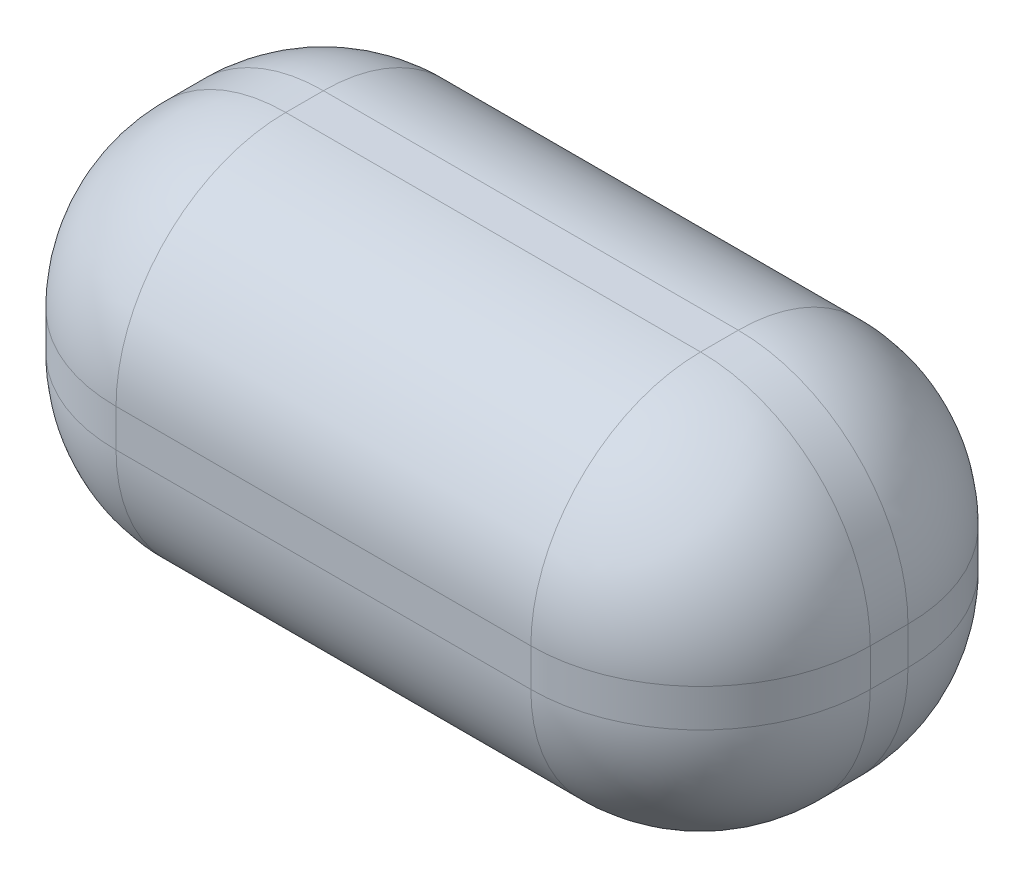
ISO-10303-21;
HEADER;
FILE_DESCRIPTION(('STEP AP214'),'2;1');
FILE_NAME('part.step','',(''),(''),'','','');
FILE_SCHEMA(('AUTOMOTIVE_DESIGN { 1 0 10303 214 1 1 1 1 }'));
ENDSEC;
DATA;
#1=APPLICATION_CONTEXT('core data for automotive mechanical design processes');
#2=APPLICATION_PROTOCOL_DEFINITION('international standard','automotive_design',2000,#1);
#3=PRODUCT_CONTEXT('',#1,'mechanical');
#4=PRODUCT('Part','Part','',(#3));
#5=PRODUCT_RELATED_PRODUCT_CATEGORY('part','',(#4));
#6=PRODUCT_DEFINITION_FORMATION('','',#4);
#7=PRODUCT_DEFINITION_CONTEXT('part definition',#1,'design');
#8=PRODUCT_DEFINITION('design','',#6,#7);
#9=PRODUCT_DEFINITION_SHAPE('','',#8);
#10=(LENGTH_UNIT() NAMED_UNIT(*) SI_UNIT(.MILLI.,.METRE.));
#11=(NAMED_UNIT(*) PLANE_ANGLE_UNIT() SI_UNIT($,.RADIAN.));
#12=(NAMED_UNIT(*) SI_UNIT($,.STERADIAN.) SOLID_ANGLE_UNIT());
#13=UNCERTAINTY_MEASURE_WITH_UNIT(LENGTH_MEASURE(1.E-05),#10,'distance_accuracy_value','');
#14=(GEOMETRIC_REPRESENTATION_CONTEXT(3) GLOBAL_UNCERTAINTY_ASSIGNED_CONTEXT((#13)) GLOBAL_UNIT_ASSIGNED_CONTEXT((#10,
#11,#12)) REPRESENTATION_CONTEXT('',''));
#15=CARTESIAN_POINT('',(0.,0.,0.));
#16=DIRECTION('',(0.,0.,1.));
#17=DIRECTION('',(1.,0.,0.));
#18=AXIS2_PLACEMENT_3D('',#15,#16,#17);
#19=CARTESIAN_POINT('',(100.,-50.,50.));
#20=DIRECTION('',(-1.,0.,0.));
#21=DIRECTION('',(0.,0.,1.));
#22=AXIS2_PLACEMENT_3D('',#19,#20,#21);
#23=PLANE('',#22);
#24=DIRECTION('',(0.,1.,0.));
#25=VECTOR('',#24,1.);
#26=CARTESIAN_POINT('',(100.,-50.,5.));
#27=LINE('',#26,#25);
#28=CARTESIAN_POINT('',(100.,5.,5.));
#29=VERTEX_POINT('',#28);
#30=CARTESIAN_POINT('',(100.,-5.,5.));
#31=VERTEX_POINT('',#30);
#32=EDGE_CURVE('E208',#29,#31,#27,.F.);
#33=ORIENTED_EDGE('',*,*,#32,.T.);
#34=DIRECTION('',(0.,0.,-1.));
#35=VECTOR('',#34,1.);
#36=CARTESIAN_POINT('',(100.,-5.,50.));
#37=LINE('',#36,#35);
#38=CARTESIAN_POINT('',(100.,-5.,-5.));
#39=VERTEX_POINT('',#38);
#40=EDGE_CURVE('E147',#31,#39,#37,.T.);
#41=ORIENTED_EDGE('',*,*,#40,.T.);
#42=DIRECTION('',(0.,1.,0.));
#43=VECTOR('',#42,1.);
#44=CARTESIAN_POINT('',(100.,50.,-5.));
#45=LINE('',#44,#43);
#46=CARTESIAN_POINT('',(100.,5.,-5.));
#47=VERTEX_POINT('',#46);
#48=EDGE_CURVE('E211',#39,#47,#45,.T.);
#49=ORIENTED_EDGE('',*,*,#48,.T.);
#50=DIRECTION('',(0.,0.,-1.));
#51=VECTOR('',#50,1.);
#52=CARTESIAN_POINT('',(100.,5.,50.));
#53=LINE('',#52,#51);
#54=EDGE_CURVE('E205',#47,#29,#53,.F.);
#55=ORIENTED_EDGE('',*,*,#54,.T.);
#56=EDGE_LOOP('',(#33,#41,#49,#55));
#57=FACE_BOUND('',#56,.T.);
#58=ADVANCED_FACE('F39',(#57),#23,.F.);
#59=CARTESIAN_POINT('',(-100.,50.,50.));
#60=DIRECTION('',(0.,-1.,0.));
#61=DIRECTION('',(0.,0.,-1.));
#62=AXIS2_PLACEMENT_3D('',#59,#60,#61);
#63=PLANE('',#62);
#64=DIRECTION('',(-1.,0.,0.));
#65=VECTOR('',#64,1.);
#66=CARTESIAN_POINT('',(-100.,50.,5.));
#67=LINE('',#66,#65);
#68=CARTESIAN_POINT('',(-55.,50.,5.));
#69=VERTEX_POINT('',#68);
#70=CARTESIAN_POINT('',(55.,50.,5.));
#71=VERTEX_POINT('',#70);
#72=EDGE_CURVE('E49',#69,#71,#67,.F.);
#73=ORIENTED_EDGE('',*,*,#72,.T.);
#74=DIRECTION('',(0.,0.,-1.));
#75=VECTOR('',#74,1.);
#76=CARTESIAN_POINT('',(55.,50.,50.));
#77=LINE('',#76,#75);
#78=CARTESIAN_POINT('',(55.,50.,-5.));
#79=VERTEX_POINT('',#78);
#80=EDGE_CURVE('E11',#71,#79,#77,.T.);
#81=ORIENTED_EDGE('',*,*,#80,.T.);
#82=DIRECTION('',(-1.,0.,0.));
#83=VECTOR('',#82,1.);
#84=CARTESIAN_POINT('',(-100.,50.,-5.));
#85=LINE('',#84,#83);
#86=CARTESIAN_POINT('',(-55.,50.,-5.));
#87=VERTEX_POINT('',#86);
#88=EDGE_CURVE('E229',#79,#87,#85,.T.);
#89=ORIENTED_EDGE('',*,*,#88,.T.);
#90=DIRECTION('',(0.,0.,-1.));
#91=VECTOR('',#90,1.);
#92=CARTESIAN_POINT('',(-55.,50.,50.));
#93=LINE('',#92,#91);
#94=EDGE_CURVE('E60',#87,#69,#93,.F.);
#95=ORIENTED_EDGE('',*,*,#94,.T.);
#96=EDGE_LOOP('',(#73,#81,#89,#95));
#97=FACE_BOUND('',#96,.T.);
#98=ADVANCED_FACE('F326',(#97),#63,.F.);
#99=CARTESIAN_POINT('',(-100.,-50.,50.));
#100=DIRECTION('',(1.,0.,0.));
#101=DIRECTION('',(0.,0.,-1.));
#102=AXIS2_PLACEMENT_3D('',#99,#100,#101);
#103=PLANE('',#102);
#104=DIRECTION('',(0.,-1.,0.));
#105=VECTOR('',#104,1.);
#106=CARTESIAN_POINT('',(-100.,-50.,-5.));
#107=LINE('',#106,#105);
#108=CARTESIAN_POINT('',(-100.,5.,-5.));
#109=VERTEX_POINT('',#108);
#110=CARTESIAN_POINT('',(-100.,-5.,-5.));
#111=VERTEX_POINT('',#110);
#112=EDGE_CURVE('E185',#109,#111,#107,.T.);
#113=ORIENTED_EDGE('',*,*,#112,.T.);
#114=DIRECTION('',(0.,0.,-1.));
#115=VECTOR('',#114,1.);
#116=CARTESIAN_POINT('',(-100.,-5.,50.));
#117=LINE('',#116,#115);
#118=CARTESIAN_POINT('',(-100.,-5.,5.));
#119=VERTEX_POINT('',#118);
#120=EDGE_CURVE('E188',#111,#119,#117,.F.);
#121=ORIENTED_EDGE('',*,*,#120,.T.);
#122=DIRECTION('',(0.,-1.,0.));
#123=VECTOR('',#122,1.);
#124=CARTESIAN_POINT('',(-100.,-50.,5.));
#125=LINE('',#124,#123);
#126=CARTESIAN_POINT('',(-100.,5.,5.));
#127=VERTEX_POINT('',#126);
#128=EDGE_CURVE('E182',#119,#127,#125,.F.);
#129=ORIENTED_EDGE('',*,*,#128,.T.);
#130=DIRECTION('',(0.,0.,-1.));
#131=VECTOR('',#130,1.);
#132=CARTESIAN_POINT('',(-100.,5.,50.));
#133=LINE('',#132,#131);
#134=EDGE_CURVE('E179',#127,#109,#133,.T.);
#135=ORIENTED_EDGE('',*,*,#134,.T.);
#136=EDGE_LOOP('',(#113,#121,#129,#135));
#137=FACE_BOUND('',#136,.T.);
#138=ADVANCED_FACE('F386',(#137),#103,.F.);
#139=CARTESIAN_POINT('',(-100.,-50.,50.));
#140=DIRECTION('',(0.,1.,0.));
#141=DIRECTION('',(0.,0.,1.));
#142=AXIS2_PLACEMENT_3D('',#139,#140,#141);
#143=PLANE('',#142);
#144=DIRECTION('',(1.,0.,0.));
#145=VECTOR('',#144,1.);
#146=CARTESIAN_POINT('',(-100.,-50.,5.));
#147=LINE('',#146,#145);
#148=CARTESIAN_POINT('',(55.,-50.,5.));
#149=VERTEX_POINT('',#148);
#150=CARTESIAN_POINT('',(-55.,-50.,5.));
#151=VERTEX_POINT('',#150);
#152=EDGE_CURVE('E132',#149,#151,#147,.F.);
#153=ORIENTED_EDGE('',*,*,#152,.T.);
#154=DIRECTION('',(0.,0.,-1.));
#155=VECTOR('',#154,1.);
#156=CARTESIAN_POINT('',(-55.,-50.,50.));
#157=LINE('',#156,#155);
#158=CARTESIAN_POINT('',(-55.,-50.,-5.));
#159=VERTEX_POINT('',#158);
#160=EDGE_CURVE('E176',#151,#159,#157,.T.);
#161=ORIENTED_EDGE('',*,*,#160,.T.);
#162=DIRECTION('',(1.,0.,0.));
#163=VECTOR('',#162,1.);
#164=CARTESIAN_POINT('',(100.,-50.,-5.));
#165=LINE('',#164,#163);
#166=CARTESIAN_POINT('',(55.,-50.,-5.));
#167=VERTEX_POINT('',#166);
#168=EDGE_CURVE('E135',#159,#167,#165,.T.);
#169=ORIENTED_EDGE('',*,*,#168,.T.);
#170=DIRECTION('',(0.,0.,-1.));
#171=VECTOR('',#170,1.);
#172=CARTESIAN_POINT('',(55.,-50.,50.));
#173=LINE('',#172,#171);
#174=EDGE_CURVE('E127',#167,#149,#173,.F.);
#175=ORIENTED_EDGE('',*,*,#174,.T.);
#176=EDGE_LOOP('',(#153,#161,#169,#175));
#177=FACE_BOUND('',#176,.T.);
#178=ADVANCED_FACE('F129',(#177),#143,.F.);
#179=CARTESIAN_POINT('',(0.,0.,50.));
#180=DIRECTION('',(0.,0.,-1.));
#181=DIRECTION('',(-1.,0.,0.));
#182=AXIS2_PLACEMENT_3D('',#179,#180,#181);
#183=PLANE('',#182);
#184=DIRECTION('',(0.,-1.,0.));
#185=VECTOR('',#184,1.);
#186=CARTESIAN_POINT('',(-55.,0.,50.));
#187=LINE('',#186,#185);
#188=CARTESIAN_POINT('',(-55.,5.,50.));
#189=VERTEX_POINT('',#188);
#190=CARTESIAN_POINT('',(-55.,-5.,50.));
#191=VERTEX_POINT('',#190);
#192=EDGE_CURVE('E222',#189,#191,#187,.T.);
#193=ORIENTED_EDGE('',*,*,#192,.T.);
#194=DIRECTION('',(1.,0.,0.));
#195=VECTOR('',#194,1.);
#196=CARTESIAN_POINT('',(0.,-5.,50.));
#197=LINE('',#196,#195);
#198=CARTESIAN_POINT('',(55.,-5.,50.));
#199=VERTEX_POINT('',#198);
#200=EDGE_CURVE('E225',#191,#199,#197,.T.);
#201=ORIENTED_EDGE('',*,*,#200,.T.);
#202=DIRECTION('',(0.,1.,0.));
#203=VECTOR('',#202,1.);
#204=CARTESIAN_POINT('',(55.,0.,50.));
#205=LINE('',#204,#203);
#206=CARTESIAN_POINT('',(55.,5.,50.));
#207=VERTEX_POINT('',#206);
#208=EDGE_CURVE('E219',#199,#207,#205,.T.);
#209=ORIENTED_EDGE('',*,*,#208,.T.);
#210=DIRECTION('',(-1.,0.,0.));
#211=VECTOR('',#210,1.);
#212=CARTESIAN_POINT('',(0.,5.,50.));
#213=LINE('',#212,#211);
#214=EDGE_CURVE('E216',#207,#189,#213,.T.);
#215=ORIENTED_EDGE('',*,*,#214,.T.);
#216=EDGE_LOOP('',(#193,#201,#209,#215));
#217=FACE_BOUND('',#216,.T.);
#218=ADVANCED_FACE('F351',(#217),#183,.F.);
#219=CARTESIAN_POINT('',(0.,0.,-50.));
#220=DIRECTION('',(0.,0.,-1.));
#221=DIRECTION('',(-1.,0.,0.));
#222=AXIS2_PLACEMENT_3D('',#219,#220,#221);
#223=PLANE('',#222);
#224=DIRECTION('',(1.,0.,0.));
#225=VECTOR('',#224,1.);
#226=CARTESIAN_POINT('',(-100.,-5.,-50.));
#227=LINE('',#226,#225);
#228=CARTESIAN_POINT('',(55.,-5.,-50.));
#229=VERTEX_POINT('',#228);
#230=CARTESIAN_POINT('',(-55.,-5.,-50.));
#231=VERTEX_POINT('',#230);
#232=EDGE_CURVE('E198',#229,#231,#227,.F.);
#233=ORIENTED_EDGE('',*,*,#232,.T.);
#234=DIRECTION('',(0.,-1.,0.));
#235=VECTOR('',#234,1.);
#236=CARTESIAN_POINT('',(-55.,50.,-50.));
#237=LINE('',#236,#235);
#238=CARTESIAN_POINT('',(-55.,5.,-50.));
#239=VERTEX_POINT('',#238);
#240=EDGE_CURVE('E201',#231,#239,#237,.F.);
#241=ORIENTED_EDGE('',*,*,#240,.T.);
#242=DIRECTION('',(-1.,0.,0.));
#243=VECTOR('',#242,1.);
#244=CARTESIAN_POINT('',(100.,5.,-50.));
#245=LINE('',#244,#243);
#246=CARTESIAN_POINT('',(55.,5.,-50.));
#247=VERTEX_POINT('',#246);
#248=EDGE_CURVE('E192',#239,#247,#245,.F.);
#249=ORIENTED_EDGE('',*,*,#248,.T.);
#250=DIRECTION('',(0.,1.,0.));
#251=VECTOR('',#250,1.);
#252=CARTESIAN_POINT('',(55.,-50.,-50.));
#253=LINE('',#252,#251);
#254=EDGE_CURVE('E195',#247,#229,#253,.F.);
#255=ORIENTED_EDGE('',*,*,#254,.T.);
#256=EDGE_LOOP('',(#233,#241,#249,#255));
#257=FACE_BOUND('',#256,.T.);
#258=ADVANCED_FACE('F319',(#257),#223,.T.);
#259=CARTESIAN_POINT('',(55.,5.,50.));
#260=DIRECTION('',(0.,0.,-1.));
#261=DIRECTION('',(-1.,0.,0.));
#262=AXIS2_PLACEMENT_3D('',#259,#260,#261);
#263=CYLINDRICAL_SURFACE('',#262,45.);
#264=CARTESIAN_POINT('',(55.,5.,5.));
#265=DIRECTION('',(0.,0.,1.));
#266=DIRECTION('',(1.,0.,0.));
#267=AXIS2_PLACEMENT_3D('',#264,#265,#266);
#268=CIRCLE('',#267,45.);
#269=EDGE_CURVE('E43',#29,#71,#268,.T.);
#270=ORIENTED_EDGE('',*,*,#269,.F.);
#271=ORIENTED_EDGE('',*,*,#54,.F.);
#272=CARTESIAN_POINT('',(55.,5.,-5.));
#273=DIRECTION('',(0.,0.,-1.));
#274=DIRECTION('',(-1.,0.,0.));
#275=AXIS2_PLACEMENT_3D('',#272,#273,#274);
#276=CIRCLE('',#275,45.);
#277=EDGE_CURVE('E172',#79,#47,#276,.T.);
#278=ORIENTED_EDGE('',*,*,#277,.F.);
#279=ORIENTED_EDGE('',*,*,#80,.F.);
#280=EDGE_LOOP('',(#270,#271,#278,#279));
#281=FACE_BOUND('',#280,.T.);
#282=ADVANCED_FACE('F41',(#281),#263,.T.);
#283=CARTESIAN_POINT('',(55.,5.,5.));
#284=DIRECTION('',(0.,0.,1.));
#285=DIRECTION('',(1.,0.,0.));
#286=AXIS2_PLACEMENT_3D('',#283,#284,#285);
#287=SPHERICAL_SURFACE('',#286,45.);
#288=CARTESIAN_POINT('',(55.,5.,5.));
#289=DIRECTION('',(0.,1.,0.));
#290=DIRECTION('',(0.,0.,1.));
#291=AXIS2_PLACEMENT_3D('',#288,#289,#290);
#292=CIRCLE('',#291,45.);
#293=EDGE_CURVE('E296',#29,#207,#292,.F.);
#294=ORIENTED_EDGE('',*,*,#293,.F.);
#295=ORIENTED_EDGE('',*,*,#269,.T.);
#296=CARTESIAN_POINT('',(55.,5.,5.));
#297=DIRECTION('',(1.,0.,0.));
#298=DIRECTION('',(0.,0.,-1.));
#299=AXIS2_PLACEMENT_3D('',#296,#297,#298);
#300=CIRCLE('',#299,45.);
#301=EDGE_CURVE('E300',#207,#71,#300,.F.);
#302=ORIENTED_EDGE('',*,*,#301,.F.);
#303=EDGE_LOOP('',(#294,#295,#302));
#304=FACE_BOUND('',#303,.T.);
#305=ADVANCED_FACE('F344',(#304),#287,.T.);
#306=CARTESIAN_POINT('',(55.,5.,-5.));
#307=DIRECTION('',(0.,0.,1.));
#308=DIRECTION('',(1.,0.,0.));
#309=AXIS2_PLACEMENT_3D('',#306,#307,#308);
#310=SPHERICAL_SURFACE('',#309,45.);
#311=CARTESIAN_POINT('',(55.,5.,-5.));
#312=DIRECTION('',(1.,0.,0.));
#313=DIRECTION('',(0.,0.,-1.));
#314=AXIS2_PLACEMENT_3D('',#311,#312,#313);
#315=CIRCLE('',#314,45.);
#316=EDGE_CURVE('E288',#79,#247,#315,.F.);
#317=ORIENTED_EDGE('',*,*,#316,.F.);
#318=ORIENTED_EDGE('',*,*,#277,.T.);
#319=CARTESIAN_POINT('',(55.,5.,-5.));
#320=DIRECTION('',(0.,1.,0.));
#321=DIRECTION('',(0.,0.,1.));
#322=AXIS2_PLACEMENT_3D('',#319,#320,#321);
#323=CIRCLE('',#322,45.);
#324=EDGE_CURVE('E292',#247,#47,#323,.F.);
#325=ORIENTED_EDGE('',*,*,#324,.F.);
#326=EDGE_LOOP('',(#317,#318,#325));
#327=FACE_BOUND('',#326,.T.);
#328=ADVANCED_FACE('F309',(#327),#310,.T.);
#329=CARTESIAN_POINT('',(0.,5.,5.));
#330=DIRECTION('',(-1.,0.,0.));
#331=DIRECTION('',(0.,0.,1.));
#332=AXIS2_PLACEMENT_3D('',#329,#330,#331);
#333=CYLINDRICAL_SURFACE('',#332,45.);
#334=ORIENTED_EDGE('',*,*,#301,.T.);
#335=ORIENTED_EDGE('',*,*,#72,.F.);
#336=CARTESIAN_POINT('',(-55.,5.,5.));
#337=DIRECTION('',(-1.,0.,0.));
#338=DIRECTION('',(0.,0.,1.));
#339=AXIS2_PLACEMENT_3D('',#336,#337,#338);
#340=CIRCLE('',#339,45.);
#341=EDGE_CURVE('E280',#189,#69,#340,.T.);
#342=ORIENTED_EDGE('',*,*,#341,.F.);
#343=ORIENTED_EDGE('',*,*,#214,.F.);
#344=EDGE_LOOP('',(#334,#335,#342,#343));
#345=FACE_BOUND('',#344,.T.);
#346=ADVANCED_FACE('F340',(#345),#333,.T.);
#347=CARTESIAN_POINT('',(55.,0.,5.));
#348=DIRECTION('',(0.,1.,0.));
#349=DIRECTION('',(0.,0.,1.));
#350=AXIS2_PLACEMENT_3D('',#347,#348,#349);
#351=CYLINDRICAL_SURFACE('',#350,45.);
#352=ORIENTED_EDGE('',*,*,#293,.T.);
#353=ORIENTED_EDGE('',*,*,#208,.F.);
#354=CARTESIAN_POINT('',(55.,-5.,5.));
#355=DIRECTION('',(0.,-1.,0.));
#356=DIRECTION('',(0.,0.,-1.));
#357=AXIS2_PLACEMENT_3D('',#354,#355,#356);
#358=CIRCLE('',#357,45.);
#359=EDGE_CURVE('E152',#31,#199,#358,.T.);
#360=ORIENTED_EDGE('',*,*,#359,.F.);
#361=ORIENTED_EDGE('',*,*,#32,.F.);
#362=EDGE_LOOP('',(#352,#353,#360,#361));
#363=FACE_BOUND('',#362,.T.);
#364=ADVANCED_FACE('F349',(#363),#351,.T.);
#365=CARTESIAN_POINT('',(55.,-5.,50.));
#366=DIRECTION('',(0.,0.,-1.));
#367=DIRECTION('',(-1.,0.,0.));
#368=AXIS2_PLACEMENT_3D('',#365,#366,#367);
#369=CYLINDRICAL_SURFACE('',#368,45.);
#370=CARTESIAN_POINT('',(55.,-5.,-5.));
#371=DIRECTION('',(0.,0.,-1.));
#372=DIRECTION('',(-1.,0.,0.));
#373=AXIS2_PLACEMENT_3D('',#370,#371,#372);
#374=CIRCLE('',#373,45.);
#375=EDGE_CURVE('E153',#39,#167,#374,.T.);
#376=ORIENTED_EDGE('',*,*,#375,.F.);
#377=ORIENTED_EDGE('',*,*,#40,.F.);
#378=CARTESIAN_POINT('',(55.,-5.,5.));
#379=DIRECTION('',(0.,0.,1.));
#380=DIRECTION('',(1.,0.,0.));
#381=AXIS2_PLACEMENT_3D('',#378,#379,#380);
#382=CIRCLE('',#381,45.);
#383=EDGE_CURVE('E143',#149,#31,#382,.T.);
#384=ORIENTED_EDGE('',*,*,#383,.F.);
#385=ORIENTED_EDGE('',*,*,#174,.F.);
#386=EDGE_LOOP('',(#376,#377,#384,#385));
#387=FACE_BOUND('',#386,.T.);
#388=ADVANCED_FACE('F145',(#387),#369,.T.);
#389=CARTESIAN_POINT('',(55.,-50.,-5.));
#390=DIRECTION('',(0.,-1.,0.));
#391=DIRECTION('',(0.,0.,-1.));
#392=AXIS2_PLACEMENT_3D('',#389,#390,#391);
#393=CYLINDRICAL_SURFACE('',#392,45.);
#394=ORIENTED_EDGE('',*,*,#324,.T.);
#395=ORIENTED_EDGE('',*,*,#48,.F.);
#396=CARTESIAN_POINT('',(55.,-5.,-5.));
#397=DIRECTION('',(0.,-1.,0.));
#398=DIRECTION('',(0.,0.,-1.));
#399=AXIS2_PLACEMENT_3D('',#396,#397,#398);
#400=CIRCLE('',#399,45.);
#401=EDGE_CURVE('E273',#229,#39,#400,.T.);
#402=ORIENTED_EDGE('',*,*,#401,.F.);
#403=ORIENTED_EDGE('',*,*,#254,.F.);
#404=EDGE_LOOP('',(#394,#395,#402,#403));
#405=FACE_BOUND('',#404,.T.);
#406=ADVANCED_FACE('F315',(#405),#393,.T.);
#407=CARTESIAN_POINT('',(-100.,5.,-5.));
#408=DIRECTION('',(1.,0.,0.));
#409=DIRECTION('',(0.,0.,-1.));
#410=AXIS2_PLACEMENT_3D('',#407,#408,#409);
#411=CYLINDRICAL_SURFACE('',#410,45.);
#412=ORIENTED_EDGE('',*,*,#316,.T.);
#413=ORIENTED_EDGE('',*,*,#248,.F.);
#414=CARTESIAN_POINT('',(-55.,5.,-5.));
#415=DIRECTION('',(-1.,0.,0.));
#416=DIRECTION('',(0.,0.,1.));
#417=AXIS2_PLACEMENT_3D('',#414,#415,#416);
#418=CIRCLE('',#417,45.);
#419=EDGE_CURVE('E269',#87,#239,#418,.T.);
#420=ORIENTED_EDGE('',*,*,#419,.F.);
#421=ORIENTED_EDGE('',*,*,#88,.F.);
#422=EDGE_LOOP('',(#412,#413,#420,#421));
#423=FACE_BOUND('',#422,.T.);
#424=ADVANCED_FACE('F325',(#423),#411,.T.);
#425=CARTESIAN_POINT('',(-55.,5.,50.));
#426=DIRECTION('',(0.,0.,-1.));
#427=DIRECTION('',(-1.,0.,0.));
#428=AXIS2_PLACEMENT_3D('',#425,#426,#427);
#429=CYLINDRICAL_SURFACE('',#428,45.);
#430=CARTESIAN_POINT('',(-55.,5.,5.));
#431=DIRECTION('',(0.,0.,1.));
#432=DIRECTION('',(1.,0.,0.));
#433=AXIS2_PLACEMENT_3D('',#430,#431,#432);
#434=CIRCLE('',#433,45.);
#435=EDGE_CURVE('E284',#69,#127,#434,.T.);
#436=ORIENTED_EDGE('',*,*,#435,.F.);
#437=ORIENTED_EDGE('',*,*,#94,.F.);
#438=CARTESIAN_POINT('',(-55.,5.,-5.));
#439=DIRECTION('',(0.,0.,-1.));
#440=DIRECTION('',(-1.,0.,0.));
#441=AXIS2_PLACEMENT_3D('',#438,#439,#440);
#442=CIRCLE('',#441,45.);
#443=EDGE_CURVE('E265',#109,#87,#442,.T.);
#444=ORIENTED_EDGE('',*,*,#443,.F.);
#445=ORIENTED_EDGE('',*,*,#134,.F.);
#446=EDGE_LOOP('',(#436,#437,#444,#445));
#447=FACE_BOUND('',#446,.T.);
#448=ADVANCED_FACE('F330',(#447),#429,.T.);
#449=CARTESIAN_POINT('',(-55.,5.,5.));
#450=DIRECTION('',(0.,0.,1.));
#451=DIRECTION('',(1.,0.,0.));
#452=AXIS2_PLACEMENT_3D('',#449,#450,#451);
#453=SPHERICAL_SURFACE('',#452,45.);
#454=ORIENTED_EDGE('',*,*,#341,.T.);
#455=ORIENTED_EDGE('',*,*,#435,.T.);
#456=CARTESIAN_POINT('',(-55.,5.,5.));
#457=DIRECTION('',(0.,1.,0.));
#458=DIRECTION('',(0.,0.,1.));
#459=AXIS2_PLACEMENT_3D('',#456,#457,#458);
#460=CIRCLE('',#459,45.);
#461=EDGE_CURVE('E161',#189,#127,#460,.F.);
#462=ORIENTED_EDGE('',*,*,#461,.F.);
#463=EDGE_LOOP('',(#454,#455,#462));
#464=FACE_BOUND('',#463,.T.);
#465=ADVANCED_FACE('F336',(#464),#453,.T.);
#466=CARTESIAN_POINT('',(55.,-5.,5.));
#467=DIRECTION('',(0.,0.,1.));
#468=DIRECTION('',(1.,0.,0.));
#469=AXIS2_PLACEMENT_3D('',#466,#467,#468);
#470=SPHERICAL_SURFACE('',#469,45.);
#471=ORIENTED_EDGE('',*,*,#383,.T.);
#472=ORIENTED_EDGE('',*,*,#359,.T.);
#473=CARTESIAN_POINT('',(55.,-5.,5.));
#474=DIRECTION('',(1.,0.,0.));
#475=DIRECTION('',(0.,0.,-1.));
#476=AXIS2_PLACEMENT_3D('',#473,#474,#475);
#477=CIRCLE('',#476,45.);
#478=EDGE_CURVE('E155',#149,#199,#477,.F.);
#479=ORIENTED_EDGE('',*,*,#478,.F.);
#480=EDGE_LOOP('',(#471,#472,#479));
#481=FACE_BOUND('',#480,.T.);
#482=ADVANCED_FACE('F156',(#481),#470,.T.);
#483=CARTESIAN_POINT('',(55.,-5.,-5.));
#484=DIRECTION('',(0.,0.,1.));
#485=DIRECTION('',(1.,0.,0.));
#486=AXIS2_PLACEMENT_3D('',#483,#484,#485);
#487=SPHERICAL_SURFACE('',#486,45.);
#488=ORIENTED_EDGE('',*,*,#401,.T.);
#489=ORIENTED_EDGE('',*,*,#375,.T.);
#490=CARTESIAN_POINT('',(55.,-5.,-5.));
#491=DIRECTION('',(1.,0.,0.));
#492=DIRECTION('',(0.,0.,-1.));
#493=AXIS2_PLACEMENT_3D('',#490,#491,#492);
#494=CIRCLE('',#493,45.);
#495=EDGE_CURVE('E162',#229,#167,#494,.F.);
#496=ORIENTED_EDGE('',*,*,#495,.F.);
#497=EDGE_LOOP('',(#488,#489,#496));
#498=FACE_BOUND('',#497,.T.);
#499=ADVANCED_FACE('F370',(#498),#487,.T.);
#500=CARTESIAN_POINT('',(-55.,5.,-5.));
#501=DIRECTION('',(0.,0.,1.));
#502=DIRECTION('',(1.,0.,0.));
#503=AXIS2_PLACEMENT_3D('',#500,#501,#502);
#504=SPHERICAL_SURFACE('',#503,45.);
#505=ORIENTED_EDGE('',*,*,#443,.T.);
#506=ORIENTED_EDGE('',*,*,#419,.T.);
#507=CARTESIAN_POINT('',(-55.,5.,-5.));
#508=DIRECTION('',(0.,1.,0.));
#509=DIRECTION('',(0.,0.,1.));
#510=AXIS2_PLACEMENT_3D('',#507,#508,#509);
#511=CIRCLE('',#510,45.);
#512=EDGE_CURVE('E256',#109,#239,#511,.F.);
#513=ORIENTED_EDGE('',*,*,#512,.F.);
#514=EDGE_LOOP('',(#505,#506,#513));
#515=FACE_BOUND('',#514,.T.);
#516=ADVANCED_FACE('F372',(#515),#504,.T.);
#517=CARTESIAN_POINT('',(-55.,0.,5.));
#518=DIRECTION('',(0.,-1.,0.));
#519=DIRECTION('',(0.,0.,-1.));
#520=AXIS2_PLACEMENT_3D('',#517,#518,#519);
#521=CYLINDRICAL_SURFACE('',#520,45.);
#522=ORIENTED_EDGE('',*,*,#461,.T.);
#523=ORIENTED_EDGE('',*,*,#128,.F.);
#524=CARTESIAN_POINT('',(-55.,-5.,5.));
#525=DIRECTION('',(0.,-1.,0.));
#526=DIRECTION('',(0.,0.,-1.));
#527=AXIS2_PLACEMENT_3D('',#524,#525,#526);
#528=CIRCLE('',#527,45.);
#529=EDGE_CURVE('E252',#191,#119,#528,.T.);
#530=ORIENTED_EDGE('',*,*,#529,.F.);
#531=ORIENTED_EDGE('',*,*,#192,.F.);
#532=EDGE_LOOP('',(#522,#523,#530,#531));
#533=FACE_BOUND('',#532,.T.);
#534=ADVANCED_FACE('F355',(#533),#521,.T.);
#535=CARTESIAN_POINT('',(0.,-5.,5.));
#536=DIRECTION('',(1.,0.,0.));
#537=DIRECTION('',(0.,0.,-1.));
#538=AXIS2_PLACEMENT_3D('',#535,#536,#537);
#539=CYLINDRICAL_SURFACE('',#538,45.);
#540=ORIENTED_EDGE('',*,*,#478,.T.);
#541=ORIENTED_EDGE('',*,*,#200,.F.);
#542=CARTESIAN_POINT('',(-55.,-5.,5.));
#543=DIRECTION('',(-1.,0.,0.));
#544=DIRECTION('',(0.,0.,1.));
#545=AXIS2_PLACEMENT_3D('',#542,#543,#544);
#546=CIRCLE('',#545,45.);
#547=EDGE_CURVE('E166',#151,#191,#546,.T.);
#548=ORIENTED_EDGE('',*,*,#547,.F.);
#549=ORIENTED_EDGE('',*,*,#152,.F.);
#550=EDGE_LOOP('',(#540,#541,#548,#549));
#551=FACE_BOUND('',#550,.T.);
#552=ADVANCED_FACE('F164',(#551),#539,.T.);
#553=CARTESIAN_POINT('',(-100.,-5.,-5.));
#554=DIRECTION('',(-1.,0.,0.));
#555=DIRECTION('',(0.,0.,1.));
#556=AXIS2_PLACEMENT_3D('',#553,#554,#555);
#557=CYLINDRICAL_SURFACE('',#556,45.);
#558=ORIENTED_EDGE('',*,*,#495,.T.);
#559=ORIENTED_EDGE('',*,*,#168,.F.);
#560=CARTESIAN_POINT('',(-55.,-5.,-5.));
#561=DIRECTION('',(-1.,0.,0.));
#562=DIRECTION('',(0.,0.,1.));
#563=AXIS2_PLACEMENT_3D('',#560,#561,#562);
#564=CIRCLE('',#563,45.);
#565=EDGE_CURVE('E246',#231,#159,#564,.T.);
#566=ORIENTED_EDGE('',*,*,#565,.F.);
#567=ORIENTED_EDGE('',*,*,#232,.F.);
#568=EDGE_LOOP('',(#558,#559,#566,#567));
#569=FACE_BOUND('',#568,.T.);
#570=ADVANCED_FACE('F368',(#569),#557,.T.);
#571=CARTESIAN_POINT('',(-55.,-50.,-5.));
#572=DIRECTION('',(0.,1.,0.));
#573=DIRECTION('',(0.,0.,1.));
#574=AXIS2_PLACEMENT_3D('',#571,#572,#573);
#575=CYLINDRICAL_SURFACE('',#574,45.);
#576=ORIENTED_EDGE('',*,*,#512,.T.);
#577=ORIENTED_EDGE('',*,*,#240,.F.);
#578=CARTESIAN_POINT('',(-55.,-5.,-5.));
#579=DIRECTION('',(0.,-1.,0.));
#580=DIRECTION('',(0.,0.,-1.));
#581=AXIS2_PLACEMENT_3D('',#578,#579,#580);
#582=CIRCLE('',#581,45.);
#583=EDGE_CURVE('E242',#111,#231,#582,.T.);
#584=ORIENTED_EDGE('',*,*,#583,.F.);
#585=ORIENTED_EDGE('',*,*,#112,.F.);
#586=EDGE_LOOP('',(#576,#577,#584,#585));
#587=FACE_BOUND('',#586,.T.);
#588=ADVANCED_FACE('F396',(#587),#575,.T.);
#589=CARTESIAN_POINT('',(-55.,-5.,5.));
#590=DIRECTION('',(0.,0.,1.));
#591=DIRECTION('',(1.,0.,0.));
#592=AXIS2_PLACEMENT_3D('',#589,#590,#591);
#593=SPHERICAL_SURFACE('',#592,45.);
#594=ORIENTED_EDGE('',*,*,#547,.T.);
#595=ORIENTED_EDGE('',*,*,#529,.T.);
#596=CARTESIAN_POINT('',(-55.,-5.,5.));
#597=DIRECTION('',(0.,0.,1.));
#598=DIRECTION('',(1.,0.,0.));
#599=AXIS2_PLACEMENT_3D('',#596,#597,#598);
#600=CIRCLE('',#599,45.);
#601=EDGE_CURVE('E239',#151,#119,#600,.F.);
#602=ORIENTED_EDGE('',*,*,#601,.F.);
#603=EDGE_LOOP('',(#594,#595,#602));
#604=FACE_BOUND('',#603,.T.);
#605=ADVANCED_FACE('F357',(#604),#593,.T.);
#606=CARTESIAN_POINT('',(-55.,-5.,-5.));
#607=DIRECTION('',(0.,0.,1.));
#608=DIRECTION('',(1.,0.,0.));
#609=AXIS2_PLACEMENT_3D('',#606,#607,#608);
#610=SPHERICAL_SURFACE('',#609,45.);
#611=ORIENTED_EDGE('',*,*,#583,.T.);
#612=ORIENTED_EDGE('',*,*,#565,.T.);
#613=CARTESIAN_POINT('',(-55.,-5.,-5.));
#614=DIRECTION('',(0.,0.,-1.));
#615=DIRECTION('',(-1.,0.,0.));
#616=AXIS2_PLACEMENT_3D('',#613,#614,#615);
#617=CIRCLE('',#616,45.);
#618=EDGE_CURVE('E236',#111,#159,#617,.F.);
#619=ORIENTED_EDGE('',*,*,#618,.F.);
#620=EDGE_LOOP('',(#611,#612,#619));
#621=FACE_BOUND('',#620,.T.);
#622=ADVANCED_FACE('F365',(#621),#610,.T.);
#623=CARTESIAN_POINT('',(-55.,-5.,50.));
#624=DIRECTION('',(0.,0.,-1.));
#625=DIRECTION('',(-1.,0.,0.));
#626=AXIS2_PLACEMENT_3D('',#623,#624,#625);
#627=CYLINDRICAL_SURFACE('',#626,45.);
#628=ORIENTED_EDGE('',*,*,#601,.T.);
#629=ORIENTED_EDGE('',*,*,#120,.F.);
#630=ORIENTED_EDGE('',*,*,#618,.T.);
#631=ORIENTED_EDGE('',*,*,#160,.F.);
#632=EDGE_LOOP('',(#628,#629,#630,#631));
#633=FACE_BOUND('',#632,.T.);
#634=ADVANCED_FACE('F361',(#633),#627,.T.);
#635=CLOSED_SHELL('',(#58,#98,#138,#178,#218,#258,#282,#305,#328,#346,#364,#388,#406,#424,#448,
#465,#482,#499,#516,#534,#552,#570,#588,#605,#622,#634));
#636=MANIFOLD_SOLID_BREP('B2',#635);
#637=ADVANCED_BREP_SHAPE_REPRESENTATION('',(#18,#636),#14);
#638=SHAPE_DEFINITION_REPRESENTATION(#9,#637);
ENDSEC;
END-ISO-10303-21;
